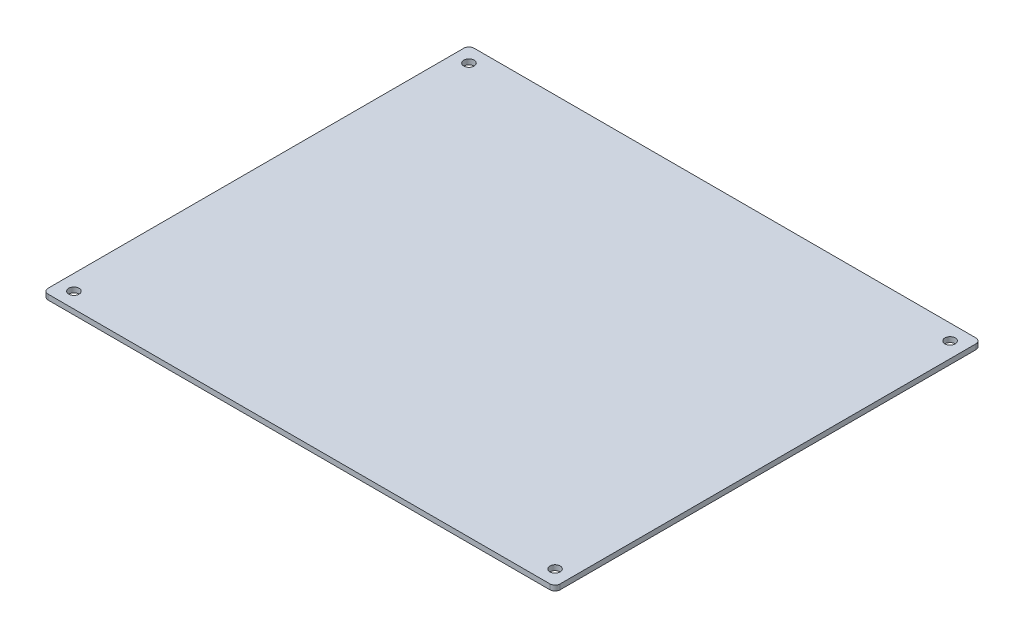
ISO-10303-21;
HEADER;
FILE_DESCRIPTION(('STEP AP214'),'2;1');
FILE_NAME('part.step','',(''),(''),'','','');
FILE_SCHEMA(('AUTOMOTIVE_DESIGN { 1 0 10303 214 1 1 1 1 }'));
ENDSEC;
DATA;
#1=APPLICATION_CONTEXT('core data for automotive mechanical design processes');
#2=APPLICATION_PROTOCOL_DEFINITION('international standard','automotive_design',2000,#1);
#3=PRODUCT_CONTEXT('',#1,'mechanical');
#4=PRODUCT('Part','Part','',(#3));
#5=PRODUCT_RELATED_PRODUCT_CATEGORY('part','',(#4));
#6=PRODUCT_DEFINITION_FORMATION('','',#4);
#7=PRODUCT_DEFINITION_CONTEXT('part definition',#1,'design');
#8=PRODUCT_DEFINITION('design','',#6,#7);
#9=PRODUCT_DEFINITION_SHAPE('','',#8);
#10=(LENGTH_UNIT() NAMED_UNIT(*) SI_UNIT(.MILLI.,.METRE.));
#11=(NAMED_UNIT(*) PLANE_ANGLE_UNIT() SI_UNIT($,.RADIAN.));
#12=(NAMED_UNIT(*) SI_UNIT($,.STERADIAN.) SOLID_ANGLE_UNIT());
#13=UNCERTAINTY_MEASURE_WITH_UNIT(LENGTH_MEASURE(1.E-05),#10,'distance_accuracy_value','');
#14=(GEOMETRIC_REPRESENTATION_CONTEXT(3) GLOBAL_UNCERTAINTY_ASSIGNED_CONTEXT((#13)) GLOBAL_UNIT_ASSIGNED_CONTEXT((#10,
#11,#12)) REPRESENTATION_CONTEXT('',''));
#15=CARTESIAN_POINT('',(0.,0.,0.));
#16=DIRECTION('',(0.,0.,1.));
#17=DIRECTION('',(1.,0.,0.));
#18=AXIS2_PLACEMENT_3D('',#15,#16,#17);
#19=CARTESIAN_POINT('',(0.,3.,0.));
#20=DIRECTION('',(0.,-1.,0.));
#21=DIRECTION('',(0.,0.,-1.));
#22=AXIS2_PLACEMENT_3D('',#19,#20,#21);
#23=PLANE('',#22);
#24=DIRECTION('',(1.,0.,0.));
#25=VECTOR('',#24,1.);
#26=CARTESIAN_POINT('',(0.,3.,0.));
#27=LINE('',#26,#25);
#28=CARTESIAN_POINT('',(3.,3.,0.));
#29=VERTEX_POINT('',#28);
#30=CARTESIAN_POINT('',(294.47,3.,0.));
#31=VERTEX_POINT('',#30);
#32=EDGE_CURVE('E199',#29,#31,#27,.T.);
#33=ORIENTED_EDGE('',*,*,#32,.T.);
#34=CARTESIAN_POINT('',(294.47,3.,-3.));
#35=DIRECTION('',(0.,-1.,0.));
#36=DIRECTION('',(0.,0.,-1.));
#37=AXIS2_PLACEMENT_3D('',#34,#35,#36);
#38=CIRCLE('',#37,3.);
#39=CARTESIAN_POINT('',(297.47,3.,-3.));
#40=VERTEX_POINT('',#39);
#41=EDGE_CURVE('E174',#31,#40,#38,.F.);
#42=ORIENTED_EDGE('',*,*,#41,.T.);
#43=DIRECTION('',(0.,0.,-1.));
#44=VECTOR('',#43,1.);
#45=CARTESIAN_POINT('',(297.47,3.,0.));
#46=LINE('',#45,#44);
#47=CARTESIAN_POINT('',(297.47,3.,-244.47));
#48=VERTEX_POINT('',#47);
#49=EDGE_CURVE('E130',#40,#48,#46,.T.);
#50=ORIENTED_EDGE('',*,*,#49,.T.);
#51=CARTESIAN_POINT('',(294.47,3.,-244.47));
#52=DIRECTION('',(0.,-1.,0.));
#53=DIRECTION('',(0.,0.,-1.));
#54=AXIS2_PLACEMENT_3D('',#51,#52,#53);
#55=CIRCLE('',#54,3.);
#56=CARTESIAN_POINT('',(294.47,3.,-247.47));
#57=VERTEX_POINT('',#56);
#58=EDGE_CURVE('E65',#48,#57,#55,.F.);
#59=ORIENTED_EDGE('',*,*,#58,.T.);
#60=DIRECTION('',(-1.,0.,0.));
#61=VECTOR('',#60,1.);
#62=CARTESIAN_POINT('',(0.,3.,-247.47));
#63=LINE('',#62,#61);
#64=CARTESIAN_POINT('',(3.,3.,-247.47));
#65=VERTEX_POINT('',#64);
#66=EDGE_CURVE('E152',#57,#65,#63,.T.);
#67=ORIENTED_EDGE('',*,*,#66,.T.);
#68=CARTESIAN_POINT('',(3.,3.,-244.47));
#69=DIRECTION('',(0.,-1.,0.));
#70=DIRECTION('',(0.,0.,-1.));
#71=AXIS2_PLACEMENT_3D('',#68,#69,#70);
#72=CIRCLE('',#71,3.);
#73=CARTESIAN_POINT('',(0.,3.,-244.47));
#74=VERTEX_POINT('',#73);
#75=EDGE_CURVE('E169',#65,#74,#72,.F.);
#76=ORIENTED_EDGE('',*,*,#75,.T.);
#77=DIRECTION('',(0.,0.,1.));
#78=VECTOR('',#77,1.);
#79=CARTESIAN_POINT('',(0.,3.,0.));
#80=LINE('',#79,#78);
#81=CARTESIAN_POINT('',(0.,3.,-3.));
#82=VERTEX_POINT('',#81);
#83=EDGE_CURVE('E145',#74,#82,#80,.T.);
#84=ORIENTED_EDGE('',*,*,#83,.T.);
#85=CARTESIAN_POINT('',(3.,3.,-3.));
#86=DIRECTION('',(0.,-1.,0.));
#87=DIRECTION('',(0.,0.,-1.));
#88=AXIS2_PLACEMENT_3D('',#85,#86,#87);
#89=CIRCLE('',#88,3.);
#90=EDGE_CURVE('E166',#82,#29,#89,.F.);
#91=ORIENTED_EDGE('',*,*,#90,.T.);
#92=EDGE_LOOP('',(#33,#42,#50,#59,#67,#76,#84,#91));
#93=FACE_BOUND('',#92,.T.);
#94=CARTESIAN_POINT('',(9.,3.,-238.47));
#95=DIRECTION('',(0.,1.,0.));
#96=DIRECTION('',(0.,0.,1.));
#97=AXIS2_PLACEMENT_3D('',#94,#95,#96);
#98=CIRCLE('',#97,3.);
#99=CARTESIAN_POINT('',(9.,3.,-235.47));
#100=VERTEX_POINT('',#99);
#101=EDGE_CURVE('E205',#100,#100,#98,.T.);
#102=ORIENTED_EDGE('',*,*,#101,.F.);
#103=EDGE_LOOP('',(#102));
#104=FACE_BOUND('',#103,.T.);
#105=CARTESIAN_POINT('',(288.47,3.,-238.47));
#106=DIRECTION('',(0.,1.,0.));
#107=DIRECTION('',(0.,0.,-1.));
#108=AXIS2_PLACEMENT_3D('',#105,#106,#107);
#109=CIRCLE('',#108,2.99999999999993);
#110=CARTESIAN_POINT('',(288.47,3.,-241.47));
#111=VERTEX_POINT('',#110);
#112=EDGE_CURVE('E220',#111,#111,#109,.T.);
#113=ORIENTED_EDGE('',*,*,#112,.F.);
#114=EDGE_LOOP('',(#113));
#115=FACE_BOUND('',#114,.T.);
#116=CARTESIAN_POINT('',(288.47,3.,-9.00000000000001));
#117=DIRECTION('',(0.,1.,0.));
#118=DIRECTION('',(0.,0.,1.));
#119=AXIS2_PLACEMENT_3D('',#116,#117,#118);
#120=CIRCLE('',#119,2.99999999999994);
#121=CARTESIAN_POINT('',(288.47,3.,-6.00000000000007));
#122=VERTEX_POINT('',#121);
#123=EDGE_CURVE('E226',#122,#122,#120,.T.);
#124=ORIENTED_EDGE('',*,*,#123,.F.);
#125=EDGE_LOOP('',(#124));
#126=FACE_BOUND('',#125,.T.);
#127=CARTESIAN_POINT('',(9.,3.,-9.00000000000001));
#128=DIRECTION('',(0.,1.,0.));
#129=DIRECTION('',(0.,0.,-1.));
#130=AXIS2_PLACEMENT_3D('',#127,#128,#129);
#131=CIRCLE('',#130,3.);
#132=CARTESIAN_POINT('',(9.,3.,-12.));
#133=VERTEX_POINT('',#132);
#134=EDGE_CURVE('E234',#133,#133,#131,.T.);
#135=ORIENTED_EDGE('',*,*,#134,.F.);
#136=EDGE_LOOP('',(#135));
#137=FACE_BOUND('',#136,.T.);
#138=ADVANCED_FACE('F42',(#93,#104,#115,#126,#137),#23,.F.);
#139=CARTESIAN_POINT('',(0.,0.,0.));
#140=DIRECTION('',(0.,-1.,0.));
#141=DIRECTION('',(0.,0.,-1.));
#142=AXIS2_PLACEMENT_3D('',#139,#140,#141);
#143=PLANE('',#142);
#144=CARTESIAN_POINT('',(288.47,0.,-9.00000000000001));
#145=DIRECTION('',(0.,1.,0.));
#146=DIRECTION('',(0.,0.,1.));
#147=AXIS2_PLACEMENT_3D('',#144,#145,#146);
#148=CIRCLE('',#147,2.99999999999994);
#149=CARTESIAN_POINT('',(288.47,0.,-6.00000000000007));
#150=VERTEX_POINT('',#149);
#151=EDGE_CURVE('E230',#150,#150,#148,.T.);
#152=ORIENTED_EDGE('',*,*,#151,.T.);
#153=EDGE_LOOP('',(#152));
#154=FACE_BOUND('',#153,.T.);
#155=CARTESIAN_POINT('',(9.,0.,-238.47));
#156=DIRECTION('',(0.,1.,0.));
#157=DIRECTION('',(0.,0.,1.));
#158=AXIS2_PLACEMENT_3D('',#155,#156,#157);
#159=CIRCLE('',#158,3.);
#160=CARTESIAN_POINT('',(9.,0.,-235.47));
#161=VERTEX_POINT('',#160);
#162=EDGE_CURVE('E209',#161,#161,#159,.T.);
#163=ORIENTED_EDGE('',*,*,#162,.T.);
#164=EDGE_LOOP('',(#163));
#165=FACE_BOUND('',#164,.T.);
#166=DIRECTION('',(0.,0.,-1.));
#167=VECTOR('',#166,1.);
#168=CARTESIAN_POINT('',(297.47,0.,0.));
#169=LINE('',#168,#167);
#170=CARTESIAN_POINT('',(297.47,0.,-3.));
#171=VERTEX_POINT('',#170);
#172=CARTESIAN_POINT('',(297.47,0.,-244.47));
#173=VERTEX_POINT('',#172);
#174=EDGE_CURVE('E128',#171,#173,#169,.T.);
#175=ORIENTED_EDGE('',*,*,#174,.F.);
#176=CARTESIAN_POINT('',(294.47,0.,-3.));
#177=DIRECTION('',(0.,-1.,0.));
#178=DIRECTION('',(0.,0.,-1.));
#179=AXIS2_PLACEMENT_3D('',#176,#177,#178);
#180=CIRCLE('',#179,3.);
#181=CARTESIAN_POINT('',(294.47,0.,0.));
#182=VERTEX_POINT('',#181);
#183=EDGE_CURVE('E110',#171,#182,#180,.T.);
#184=ORIENTED_EDGE('',*,*,#183,.T.);
#185=DIRECTION('',(1.,0.,0.));
#186=VECTOR('',#185,1.);
#187=CARTESIAN_POINT('',(0.,0.,0.));
#188=LINE('',#187,#186);
#189=CARTESIAN_POINT('',(3.,0.,0.));
#190=VERTEX_POINT('',#189);
#191=EDGE_CURVE('E140',#190,#182,#188,.T.);
#192=ORIENTED_EDGE('',*,*,#191,.F.);
#193=CARTESIAN_POINT('',(3.,0.,-3.));
#194=DIRECTION('',(0.,-1.,0.));
#195=DIRECTION('',(0.,0.,-1.));
#196=AXIS2_PLACEMENT_3D('',#193,#194,#195);
#197=CIRCLE('',#196,3.);
#198=CARTESIAN_POINT('',(0.,0.,-3.));
#199=VERTEX_POINT('',#198);
#200=EDGE_CURVE('E132',#190,#199,#197,.T.);
#201=ORIENTED_EDGE('',*,*,#200,.T.);
#202=DIRECTION('',(0.,0.,1.));
#203=VECTOR('',#202,1.);
#204=CARTESIAN_POINT('',(0.,0.,0.));
#205=LINE('',#204,#203);
#206=CARTESIAN_POINT('',(0.,0.,-244.47));
#207=VERTEX_POINT('',#206);
#208=EDGE_CURVE('E147',#207,#199,#205,.T.);
#209=ORIENTED_EDGE('',*,*,#208,.F.);
#210=CARTESIAN_POINT('',(3.,0.,-244.47));
#211=DIRECTION('',(0.,-1.,0.));
#212=DIRECTION('',(0.,0.,-1.));
#213=AXIS2_PLACEMENT_3D('',#210,#211,#212);
#214=CIRCLE('',#213,3.);
#215=CARTESIAN_POINT('',(3.,0.,-247.47));
#216=VERTEX_POINT('',#215);
#217=EDGE_CURVE('E156',#207,#216,#214,.T.);
#218=ORIENTED_EDGE('',*,*,#217,.T.);
#219=DIRECTION('',(-1.,0.,0.));
#220=VECTOR('',#219,1.);
#221=CARTESIAN_POINT('',(0.,0.,-247.47));
#222=LINE('',#221,#220);
#223=CARTESIAN_POINT('',(294.47,0.,-247.47));
#224=VERTEX_POINT('',#223);
#225=EDGE_CURVE('E139',#224,#216,#222,.T.);
#226=ORIENTED_EDGE('',*,*,#225,.F.);
#227=CARTESIAN_POINT('',(294.47,0.,-244.47));
#228=DIRECTION('',(0.,-1.,0.));
#229=DIRECTION('',(0.,0.,-1.));
#230=AXIS2_PLACEMENT_3D('',#227,#228,#229);
#231=CIRCLE('',#230,3.);
#232=EDGE_CURVE('E122',#224,#173,#231,.T.);
#233=ORIENTED_EDGE('',*,*,#232,.T.);
#234=EDGE_LOOP('',(#175,#184,#192,#201,#209,#218,#226,#233));
#235=FACE_BOUND('',#234,.T.);
#236=CARTESIAN_POINT('',(288.47,0.,-238.47));
#237=DIRECTION('',(0.,1.,0.));
#238=DIRECTION('',(0.,0.,-1.));
#239=AXIS2_PLACEMENT_3D('',#236,#237,#238);
#240=CIRCLE('',#239,2.99999999999993);
#241=CARTESIAN_POINT('',(288.47,0.,-241.47));
#242=VERTEX_POINT('',#241);
#243=EDGE_CURVE('E222',#242,#242,#240,.T.);
#244=ORIENTED_EDGE('',*,*,#243,.T.);
#245=EDGE_LOOP('',(#244));
#246=FACE_BOUND('',#245,.T.);
#247=CARTESIAN_POINT('',(9.,0.,-9.00000000000001));
#248=DIRECTION('',(0.,1.,0.));
#249=DIRECTION('',(0.,0.,-1.));
#250=AXIS2_PLACEMENT_3D('',#247,#248,#249);
#251=CIRCLE('',#250,3.);
#252=CARTESIAN_POINT('',(9.,0.,-12.));
#253=VERTEX_POINT('',#252);
#254=EDGE_CURVE('E238',#253,#253,#251,.T.);
#255=ORIENTED_EDGE('',*,*,#254,.T.);
#256=EDGE_LOOP('',(#255));
#257=FACE_BOUND('',#256,.T.);
#258=ADVANCED_FACE('F135',(#154,#165,#235,#246,#257),#143,.T.);
#259=CARTESIAN_POINT('',(0.,3.,0.));
#260=DIRECTION('',(1.,0.,0.));
#261=DIRECTION('',(0.,0.,-1.));
#262=AXIS2_PLACEMENT_3D('',#259,#260,#261);
#263=PLANE('',#262);
#264=ORIENTED_EDGE('',*,*,#83,.F.);
#265=DIRECTION('',(0.,-1.,0.));
#266=VECTOR('',#265,1.);
#267=CARTESIAN_POINT('',(0.,3.,-244.47));
#268=LINE('',#267,#266);
#269=EDGE_CURVE('E11',#74,#207,#268,.T.);
#270=ORIENTED_EDGE('',*,*,#269,.T.);
#271=ORIENTED_EDGE('',*,*,#208,.T.);
#272=DIRECTION('',(0.,-1.,0.));
#273=VECTOR('',#272,1.);
#274=CARTESIAN_POINT('',(0.,3.,-3.));
#275=LINE('',#274,#273);
#276=EDGE_CURVE('E51',#199,#82,#275,.F.);
#277=ORIENTED_EDGE('',*,*,#276,.T.);
#278=EDGE_LOOP('',(#264,#270,#271,#277));
#279=FACE_BOUND('',#278,.T.);
#280=ADVANCED_FACE('F189',(#279),#263,.F.);
#281=CARTESIAN_POINT('',(0.,3.,0.));
#282=DIRECTION('',(0.,0.,-1.));
#283=DIRECTION('',(-1.,0.,0.));
#284=AXIS2_PLACEMENT_3D('',#281,#282,#283);
#285=PLANE('',#284);
#286=ORIENTED_EDGE('',*,*,#191,.T.);
#287=DIRECTION('',(0.,-1.,0.));
#288=VECTOR('',#287,1.);
#289=CARTESIAN_POINT('',(294.47,3.,0.));
#290=LINE('',#289,#288);
#291=EDGE_CURVE('E115',#182,#31,#290,.F.);
#292=ORIENTED_EDGE('',*,*,#291,.T.);
#293=ORIENTED_EDGE('',*,*,#32,.F.);
#294=DIRECTION('',(0.,-1.,0.));
#295=VECTOR('',#294,1.);
#296=CARTESIAN_POINT('',(3.,3.,0.));
#297=LINE('',#296,#295);
#298=EDGE_CURVE('E121',#29,#190,#297,.T.);
#299=ORIENTED_EDGE('',*,*,#298,.T.);
#300=EDGE_LOOP('',(#286,#292,#293,#299));
#301=FACE_BOUND('',#300,.T.);
#302=ADVANCED_FACE('F203',(#301),#285,.F.);
#303=CARTESIAN_POINT('',(297.47,3.,0.));
#304=DIRECTION('',(-1.,0.,0.));
#305=DIRECTION('',(0.,0.,1.));
#306=AXIS2_PLACEMENT_3D('',#303,#304,#305);
#307=PLANE('',#306);
#308=ORIENTED_EDGE('',*,*,#49,.F.);
#309=DIRECTION('',(0.,-1.,0.));
#310=VECTOR('',#309,1.);
#311=CARTESIAN_POINT('',(297.47,3.,-3.));
#312=LINE('',#311,#310);
#313=EDGE_CURVE('E114',#40,#171,#312,.T.);
#314=ORIENTED_EDGE('',*,*,#313,.T.);
#315=ORIENTED_EDGE('',*,*,#174,.T.);
#316=DIRECTION('',(0.,-1.,0.));
#317=VECTOR('',#316,1.);
#318=CARTESIAN_POINT('',(297.47,3.,-244.47));
#319=LINE('',#318,#317);
#320=EDGE_CURVE('E133',#173,#48,#319,.F.);
#321=ORIENTED_EDGE('',*,*,#320,.T.);
#322=EDGE_LOOP('',(#308,#314,#315,#321));
#323=FACE_BOUND('',#322,.T.);
#324=ADVANCED_FACE('F127',(#323),#307,.F.);
#325=CARTESIAN_POINT('',(0.,3.,-247.47));
#326=DIRECTION('',(0.,0.,1.));
#327=DIRECTION('',(1.,0.,0.));
#328=AXIS2_PLACEMENT_3D('',#325,#326,#327);
#329=PLANE('',#328);
#330=ORIENTED_EDGE('',*,*,#66,.F.);
#331=DIRECTION('',(0.,-1.,0.));
#332=VECTOR('',#331,1.);
#333=CARTESIAN_POINT('',(294.47,3.,-247.47));
#334=LINE('',#333,#332);
#335=EDGE_CURVE('E179',#57,#224,#334,.T.);
#336=ORIENTED_EDGE('',*,*,#335,.T.);
#337=ORIENTED_EDGE('',*,*,#225,.T.);
#338=DIRECTION('',(0.,-1.,0.));
#339=VECTOR('',#338,1.);
#340=CARTESIAN_POINT('',(3.,3.,-247.47));
#341=LINE('',#340,#339);
#342=EDGE_CURVE('E58',#216,#65,#341,.F.);
#343=ORIENTED_EDGE('',*,*,#342,.T.);
#344=EDGE_LOOP('',(#330,#336,#337,#343));
#345=FACE_BOUND('',#344,.T.);
#346=ADVANCED_FACE('F261',(#345),#329,.F.);
#347=CARTESIAN_POINT('',(9.,3.,-238.47));
#348=DIRECTION('',(0.,-1.,0.));
#349=DIRECTION('',(0.,0.,-1.));
#350=AXIS2_PLACEMENT_3D('',#347,#348,#349);
#351=CYLINDRICAL_SURFACE('',#350,3.);
#352=ORIENTED_EDGE('',*,*,#101,.T.);
#353=EDGE_LOOP('',(#352));
#354=FACE_BOUND('',#353,.T.);
#355=ORIENTED_EDGE('',*,*,#162,.F.);
#356=EDGE_LOOP('',(#355));
#357=FACE_BOUND('',#356,.T.);
#358=ADVANCED_FACE('F258',(#354,#357),#351,.F.);
#359=CARTESIAN_POINT('',(288.47,3.,-238.47));
#360=DIRECTION('',(0.,-1.,0.));
#361=DIRECTION('',(0.,0.,-1.));
#362=AXIS2_PLACEMENT_3D('',#359,#360,#361);
#363=CYLINDRICAL_SURFACE('',#362,2.99999999999993);
#364=ORIENTED_EDGE('',*,*,#112,.T.);
#365=EDGE_LOOP('',(#364));
#366=FACE_BOUND('',#365,.T.);
#367=ORIENTED_EDGE('',*,*,#243,.F.);
#368=EDGE_LOOP('',(#367));
#369=FACE_BOUND('',#368,.T.);
#370=ADVANCED_FACE('F319',(#366,#369),#363,.F.);
#371=CARTESIAN_POINT('',(288.47,3.,-9.00000000000001));
#372=DIRECTION('',(0.,-1.,0.));
#373=DIRECTION('',(0.,0.,-1.));
#374=AXIS2_PLACEMENT_3D('',#371,#372,#373);
#375=CYLINDRICAL_SURFACE('',#374,2.99999999999994);
#376=ORIENTED_EDGE('',*,*,#123,.T.);
#377=EDGE_LOOP('',(#376));
#378=FACE_BOUND('',#377,.T.);
#379=ORIENTED_EDGE('',*,*,#151,.F.);
#380=EDGE_LOOP('',(#379));
#381=FACE_BOUND('',#380,.T.);
#382=ADVANCED_FACE('F309',(#378,#381),#375,.F.);
#383=CARTESIAN_POINT('',(9.,3.,-9.00000000000001));
#384=DIRECTION('',(0.,-1.,0.));
#385=DIRECTION('',(0.,0.,-1.));
#386=AXIS2_PLACEMENT_3D('',#383,#384,#385);
#387=CYLINDRICAL_SURFACE('',#386,3.);
#388=ORIENTED_EDGE('',*,*,#134,.T.);
#389=EDGE_LOOP('',(#388));
#390=FACE_BOUND('',#389,.T.);
#391=ORIENTED_EDGE('',*,*,#254,.F.);
#392=EDGE_LOOP('',(#391));
#393=FACE_BOUND('',#392,.T.);
#394=ADVANCED_FACE('F247',(#390,#393),#387,.F.);
#395=CARTESIAN_POINT('',(294.47,3.,-3.));
#396=DIRECTION('',(0.,-1.,0.));
#397=DIRECTION('',(0.,0.,-1.));
#398=AXIS2_PLACEMENT_3D('',#395,#396,#397);
#399=CYLINDRICAL_SURFACE('',#398,3.);
#400=ORIENTED_EDGE('',*,*,#41,.F.);
#401=ORIENTED_EDGE('',*,*,#291,.F.);
#402=ORIENTED_EDGE('',*,*,#183,.F.);
#403=ORIENTED_EDGE('',*,*,#313,.F.);
#404=EDGE_LOOP('',(#400,#401,#402,#403));
#405=FACE_BOUND('',#404,.T.);
#406=ADVANCED_FACE('F113',(#405),#399,.T.);
#407=CARTESIAN_POINT('',(294.47,3.,-244.47));
#408=DIRECTION('',(0.,-1.,0.));
#409=DIRECTION('',(0.,0.,-1.));
#410=AXIS2_PLACEMENT_3D('',#407,#408,#409);
#411=CYLINDRICAL_SURFACE('',#410,3.);
#412=ORIENTED_EDGE('',*,*,#58,.F.);
#413=ORIENTED_EDGE('',*,*,#320,.F.);
#414=ORIENTED_EDGE('',*,*,#232,.F.);
#415=ORIENTED_EDGE('',*,*,#335,.F.);
#416=EDGE_LOOP('',(#412,#413,#414,#415));
#417=FACE_BOUND('',#416,.T.);
#418=ADVANCED_FACE('F272',(#417),#411,.T.);
#419=CARTESIAN_POINT('',(3.,3.,-244.47));
#420=DIRECTION('',(0.,-1.,0.));
#421=DIRECTION('',(0.,0.,-1.));
#422=AXIS2_PLACEMENT_3D('',#419,#420,#421);
#423=CYLINDRICAL_SURFACE('',#422,3.);
#424=ORIENTED_EDGE('',*,*,#75,.F.);
#425=ORIENTED_EDGE('',*,*,#342,.F.);
#426=ORIENTED_EDGE('',*,*,#217,.F.);
#427=ORIENTED_EDGE('',*,*,#269,.F.);
#428=EDGE_LOOP('',(#424,#425,#426,#427));
#429=FACE_BOUND('',#428,.T.);
#430=ADVANCED_FACE('F274',(#429),#423,.T.);
#431=CARTESIAN_POINT('',(3.,3.,-3.));
#432=DIRECTION('',(0.,-1.,0.));
#433=DIRECTION('',(0.,0.,-1.));
#434=AXIS2_PLACEMENT_3D('',#431,#432,#433);
#435=CYLINDRICAL_SURFACE('',#434,3.);
#436=ORIENTED_EDGE('',*,*,#90,.F.);
#437=ORIENTED_EDGE('',*,*,#276,.F.);
#438=ORIENTED_EDGE('',*,*,#200,.F.);
#439=ORIENTED_EDGE('',*,*,#298,.F.);
#440=EDGE_LOOP('',(#436,#437,#438,#439));
#441=FACE_BOUND('',#440,.T.);
#442=ADVANCED_FACE('F44',(#441),#435,.T.);
#443=CLOSED_SHELL('',(#138,#258,#280,#302,#324,#346,#358,#370,#382,#394,#406,#418,#430,#442));
#444=MANIFOLD_SOLID_BREP('B2',#443);
#445=ADVANCED_BREP_SHAPE_REPRESENTATION('',(#18,#444),#14);
#446=SHAPE_DEFINITION_REPRESENTATION(#9,#445);
ENDSEC;
END-ISO-10303-21;
